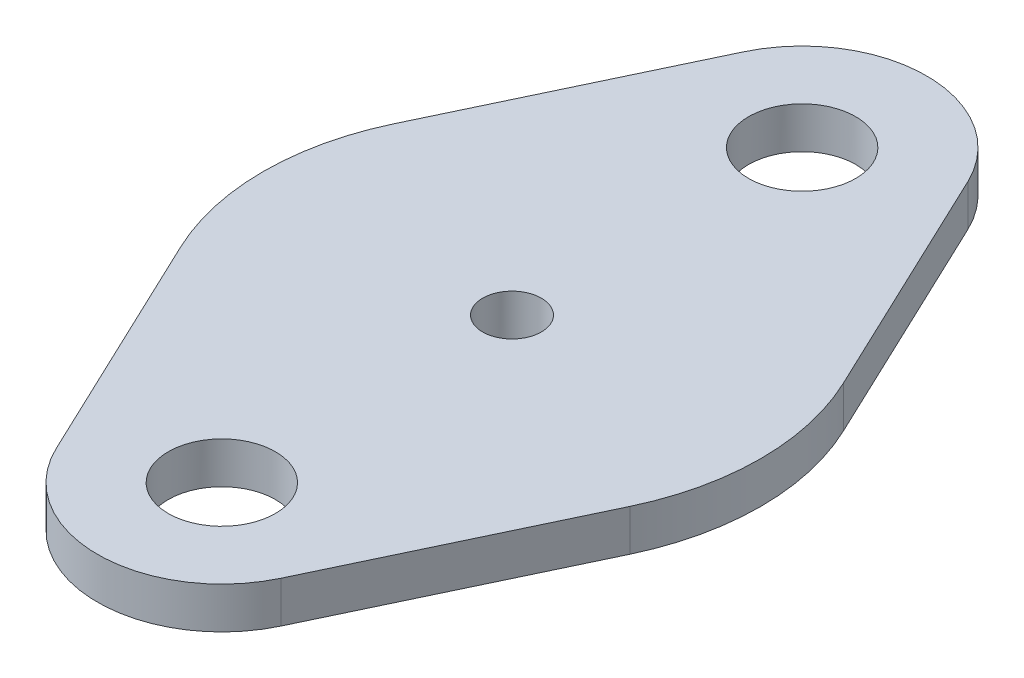
ISO-10303-21;
HEADER;
FILE_DESCRIPTION(('STEP AP214'),'2;1');
FILE_NAME('part.step','',(''),(''),'','','');
FILE_SCHEMA(('AUTOMOTIVE_DESIGN { 1 0 10303 214 1 1 1 1 }'));
ENDSEC;
DATA;
#1=APPLICATION_CONTEXT('core data for automotive mechanical design processes');
#2=APPLICATION_PROTOCOL_DEFINITION('international standard','automotive_design',2000,#1);
#3=PRODUCT_CONTEXT('',#1,'mechanical');
#4=PRODUCT('Part','Part','',(#3));
#5=PRODUCT_RELATED_PRODUCT_CATEGORY('part','',(#4));
#6=PRODUCT_DEFINITION_FORMATION('','',#4);
#7=PRODUCT_DEFINITION_CONTEXT('part definition',#1,'design');
#8=PRODUCT_DEFINITION('design','',#6,#7);
#9=PRODUCT_DEFINITION_SHAPE('','',#8);
#10=(LENGTH_UNIT() NAMED_UNIT(*) SI_UNIT(.MILLI.,.METRE.));
#11=(NAMED_UNIT(*) PLANE_ANGLE_UNIT() SI_UNIT($,.RADIAN.));
#12=(NAMED_UNIT(*) SI_UNIT($,.STERADIAN.) SOLID_ANGLE_UNIT());
#13=UNCERTAINTY_MEASURE_WITH_UNIT(LENGTH_MEASURE(1.E-05),#10,'distance_accuracy_value','');
#14=(GEOMETRIC_REPRESENTATION_CONTEXT(3) GLOBAL_UNCERTAINTY_ASSIGNED_CONTEXT((#13)) GLOBAL_UNIT_ASSIGNED_CONTEXT((#10,
#11,#12)) REPRESENTATION_CONTEXT('',''));
#15=CARTESIAN_POINT('',(0.,0.,0.));
#16=DIRECTION('',(0.,0.,1.));
#17=DIRECTION('',(1.,0.,0.));
#18=AXIS2_PLACEMENT_3D('',#15,#16,#17);
#19=CARTESIAN_POINT('',(0.,3.175,0.));
#20=DIRECTION('',(0.,-1.,0.));
#21=DIRECTION('',(0.,0.,-1.));
#22=AXIS2_PLACEMENT_3D('',#19,#20,#21);
#23=PLANE('',#22);
#24=CARTESIAN_POINT('',(19.05,3.175,-53.975));
#25=DIRECTION('',(0.,1.,0.));
#26=DIRECTION('',(0.,0.,1.));
#27=AXIS2_PLACEMENT_3D('',#24,#25,#26);
#28=CIRCLE('',#27,4.1021);
#29=CARTESIAN_POINT('',(19.05,3.175,-49.8729));
#30=VERTEX_POINT('',#29);
#31=EDGE_CURVE('E150',#30,#30,#28,.T.);
#32=ORIENTED_EDGE('',*,*,#31,.F.);
#33=EDGE_LOOP('',(#32));
#34=FACE_BOUND('',#33,.T.);
#35=CARTESIAN_POINT('',(19.05,3.175,-9.525));
#36=DIRECTION('',(0.,1.,0.));
#37=DIRECTION('',(0.,0.,1.));
#38=AXIS2_PLACEMENT_3D('',#35,#36,#37);
#39=CIRCLE('',#38,4.1021);
#40=CARTESIAN_POINT('',(19.05,3.175,-5.4229));
#41=VERTEX_POINT('',#40);
#42=EDGE_CURVE('E167',#41,#41,#39,.T.);
#43=ORIENTED_EDGE('',*,*,#42,.F.);
#44=EDGE_LOOP('',(#43));
#45=FACE_BOUND('',#44,.T.);
#46=CARTESIAN_POINT('',(19.05,3.175,-31.75));
#47=DIRECTION('',(0.,1.,0.));
#48=DIRECTION('',(0.,0.,1.));
#49=AXIS2_PLACEMENT_3D('',#46,#47,#48);
#50=CIRCLE('',#49,2.2479);
#51=CARTESIAN_POINT('',(19.05,3.175,-29.5021));
#52=VERTEX_POINT('',#51);
#53=EDGE_CURVE('E173',#52,#52,#50,.T.);
#54=ORIENTED_EDGE('',*,*,#53,.F.);
#55=EDGE_LOOP('',(#54));
#56=FACE_BOUND('',#55,.T.);
#57=CARTESIAN_POINT('',(19.05,3.175,-53.975));
#58=DIRECTION('',(0.,1.,0.));
#59=DIRECTION('',(0.,0.,1.));
#60=AXIS2_PLACEMENT_3D('',#57,#58,#59);
#61=CIRCLE('',#60,9.52500000000001);
#62=CARTESIAN_POINT('',(27.6559127751725,3.175,-58.0571428571429));
#63=VERTEX_POINT('',#62);
#64=CARTESIAN_POINT('',(10.4440872248275,3.175,-58.0571428571429));
#65=VERTEX_POINT('',#64);
#66=EDGE_CURVE('E132',#63,#65,#61,.T.);
#67=ORIENTED_EDGE('',*,*,#66,.T.);
#68=DIRECTION('',(-0.428571428571429,0.,0.903507902905251));
#69=VECTOR('',#68,1.);
#70=CARTESIAN_POINT('',(10.4440872248275,3.175,-58.0571428571429));
#71=LINE('',#70,#69);
#72=CARTESIAN_POINT('',(1.83817444965496,3.175,-39.9142857142857));
#73=VERTEX_POINT('',#72);
#74=EDGE_CURVE('E134',#65,#73,#71,.T.);
#75=ORIENTED_EDGE('',*,*,#74,.T.);
#76=CARTESIAN_POINT('',(19.05,3.175,-31.75));
#77=DIRECTION('',(0.,1.,0.));
#78=DIRECTION('',(0.,0.,1.));
#79=AXIS2_PLACEMENT_3D('',#76,#77,#78);
#80=CIRCLE('',#79,19.05);
#81=CARTESIAN_POINT('',(1.83817444965496,3.175,-23.5857142857143));
#82=VERTEX_POINT('',#81);
#83=EDGE_CURVE('E50',#73,#82,#80,.T.);
#84=ORIENTED_EDGE('',*,*,#83,.T.);
#85=DIRECTION('',(0.428571428571429,0.,0.903507902905251));
#86=VECTOR('',#85,1.);
#87=CARTESIAN_POINT('',(1.83817444965496,3.175,-23.5857142857143));
#88=LINE('',#87,#86);
#89=CARTESIAN_POINT('',(10.4440872248275,3.175,-5.44285714285714));
#90=VERTEX_POINT('',#89);
#91=EDGE_CURVE('E116',#82,#90,#88,.T.);
#92=ORIENTED_EDGE('',*,*,#91,.T.);
#93=CARTESIAN_POINT('',(19.05,3.175,-9.525));
#94=DIRECTION('',(0.,1.,0.));
#95=DIRECTION('',(0.,0.,1.));
#96=AXIS2_PLACEMENT_3D('',#93,#94,#95);
#97=CIRCLE('',#96,9.525);
#98=CARTESIAN_POINT('',(27.6559127751725,3.175,-5.44285714285715));
#99=VERTEX_POINT('',#98);
#100=EDGE_CURVE('E139',#90,#99,#97,.T.);
#101=ORIENTED_EDGE('',*,*,#100,.T.);
#102=DIRECTION('',(0.428571428571428,0.,-0.903507902905251));
#103=VECTOR('',#102,1.);
#104=CARTESIAN_POINT('',(36.261825550345,3.175,-23.5857142857143));
#105=LINE('',#104,#103);
#106=CARTESIAN_POINT('',(36.261825550345,3.175,-23.5857142857143));
#107=VERTEX_POINT('',#106);
#108=EDGE_CURVE('E141',#99,#107,#105,.T.);
#109=ORIENTED_EDGE('',*,*,#108,.T.);
#110=CARTESIAN_POINT('',(19.05,3.175,-31.75));
#111=DIRECTION('',(0.,1.,0.));
#112=DIRECTION('',(0.,0.,1.));
#113=AXIS2_PLACEMENT_3D('',#110,#111,#112);
#114=CIRCLE('',#113,19.05);
#115=CARTESIAN_POINT('',(36.261825550345,3.175,-39.9142857142857));
#116=VERTEX_POINT('',#115);
#117=EDGE_CURVE('E144',#107,#116,#114,.T.);
#118=ORIENTED_EDGE('',*,*,#117,.T.);
#119=DIRECTION('',(-0.428571428571428,0.,-0.903507902905251));
#120=VECTOR('',#119,1.);
#121=CARTESIAN_POINT('',(27.6559127751725,3.175,-58.0571428571429));
#122=LINE('',#121,#120);
#123=EDGE_CURVE('E127',#116,#63,#122,.T.);
#124=ORIENTED_EDGE('',*,*,#123,.T.);
#125=EDGE_LOOP('',(#67,#75,#84,#92,#101,#109,#118,#124));
#126=FACE_BOUND('',#125,.T.);
#127=ADVANCED_FACE('F35',(#34,#45,#56,#126),#23,.F.);
#128=CARTESIAN_POINT('',(0.,0.,0.));
#129=DIRECTION('',(0.,-1.,0.));
#130=DIRECTION('',(0.,0.,-1.));
#131=AXIS2_PLACEMENT_3D('',#128,#129,#130);
#132=PLANE('',#131);
#133=CARTESIAN_POINT('',(19.05,0.,-53.975));
#134=DIRECTION('',(0.,-1.,0.));
#135=DIRECTION('',(0.,0.,-1.));
#136=AXIS2_PLACEMENT_3D('',#133,#134,#135);
#137=CIRCLE('',#136,4.1021);
#138=CARTESIAN_POINT('',(19.05,0.,-58.0771));
#139=VERTEX_POINT('',#138);
#140=EDGE_CURVE('E164',#139,#139,#137,.T.);
#141=ORIENTED_EDGE('',*,*,#140,.F.);
#142=EDGE_LOOP('',(#141));
#143=FACE_BOUND('',#142,.T.);
#144=CARTESIAN_POINT('',(19.05,0.,-9.525));
#145=DIRECTION('',(0.,-1.,0.));
#146=DIRECTION('',(0.,0.,-1.));
#147=AXIS2_PLACEMENT_3D('',#144,#145,#146);
#148=CIRCLE('',#147,4.1021);
#149=CARTESIAN_POINT('',(19.05,0.,-13.6271));
#150=VERTEX_POINT('',#149);
#151=EDGE_CURVE('E170',#150,#150,#148,.T.);
#152=ORIENTED_EDGE('',*,*,#151,.F.);
#153=EDGE_LOOP('',(#152));
#154=FACE_BOUND('',#153,.T.);
#155=CARTESIAN_POINT('',(19.05,0.,-31.75));
#156=DIRECTION('',(0.,-1.,0.));
#157=DIRECTION('',(0.,0.,-1.));
#158=AXIS2_PLACEMENT_3D('',#155,#156,#157);
#159=CIRCLE('',#158,2.2479);
#160=CARTESIAN_POINT('',(19.05,0.,-33.9979));
#161=VERTEX_POINT('',#160);
#162=EDGE_CURVE('E109',#161,#161,#159,.T.);
#163=ORIENTED_EDGE('',*,*,#162,.F.);
#164=EDGE_LOOP('',(#163));
#165=FACE_BOUND('',#164,.T.);
#166=DIRECTION('',(-0.428571428571429,0.,0.903507902905251));
#167=VECTOR('',#166,1.);
#168=CARTESIAN_POINT('',(10.4440872248275,0.,-58.0571428571429));
#169=LINE('',#168,#167);
#170=CARTESIAN_POINT('',(10.4440872248275,0.,-58.0571428571429));
#171=VERTEX_POINT('',#170);
#172=CARTESIAN_POINT('',(1.83817444965496,0.,-39.9142857142857));
#173=VERTEX_POINT('',#172);
#174=EDGE_CURVE('E122',#171,#173,#169,.T.);
#175=ORIENTED_EDGE('',*,*,#174,.F.);
#176=CARTESIAN_POINT('',(19.05,0.,-53.975));
#177=DIRECTION('',(0.,-1.,0.));
#178=DIRECTION('',(0.,0.,-1.));
#179=AXIS2_PLACEMENT_3D('',#176,#177,#178);
#180=CIRCLE('',#179,9.52500000000001);
#181=CARTESIAN_POINT('',(27.6559127751725,0.,-58.0571428571429));
#182=VERTEX_POINT('',#181);
#183=EDGE_CURVE('E11',#171,#182,#180,.T.);
#184=ORIENTED_EDGE('',*,*,#183,.T.);
#185=DIRECTION('',(-0.428571428571428,0.,-0.903507902905251));
#186=VECTOR('',#185,1.);
#187=CARTESIAN_POINT('',(27.6559127751725,0.,-58.0571428571429));
#188=LINE('',#187,#186);
#189=CARTESIAN_POINT('',(36.261825550345,0.,-39.9142857142857));
#190=VERTEX_POINT('',#189);
#191=EDGE_CURVE('E125',#190,#182,#188,.T.);
#192=ORIENTED_EDGE('',*,*,#191,.F.);
#193=CARTESIAN_POINT('',(19.05,0.,-31.75));
#194=DIRECTION('',(0.,-1.,0.));
#195=DIRECTION('',(0.,0.,-1.));
#196=AXIS2_PLACEMENT_3D('',#193,#194,#195);
#197=CIRCLE('',#196,19.05);
#198=CARTESIAN_POINT('',(36.261825550345,0.,-23.5857142857143));
#199=VERTEX_POINT('',#198);
#200=EDGE_CURVE('E43',#190,#199,#197,.T.);
#201=ORIENTED_EDGE('',*,*,#200,.T.);
#202=DIRECTION('',(0.428571428571428,0.,-0.903507902905251));
#203=VECTOR('',#202,1.);
#204=CARTESIAN_POINT('',(36.261825550345,0.,-23.5857142857143));
#205=LINE('',#204,#203);
#206=CARTESIAN_POINT('',(27.6559127751725,0.,-5.44285714285715));
#207=VERTEX_POINT('',#206);
#208=EDGE_CURVE('E121',#207,#199,#205,.T.);
#209=ORIENTED_EDGE('',*,*,#208,.F.);
#210=CARTESIAN_POINT('',(19.05,0.,-9.525));
#211=DIRECTION('',(0.,-1.,0.));
#212=DIRECTION('',(0.,0.,-1.));
#213=AXIS2_PLACEMENT_3D('',#210,#211,#212);
#214=CIRCLE('',#213,9.525);
#215=CARTESIAN_POINT('',(10.4440872248275,0.,-5.44285714285714));
#216=VERTEX_POINT('',#215);
#217=EDGE_CURVE('E108',#207,#216,#214,.T.);
#218=ORIENTED_EDGE('',*,*,#217,.T.);
#219=DIRECTION('',(0.428571428571429,0.,0.903507902905251));
#220=VECTOR('',#219,1.);
#221=CARTESIAN_POINT('',(1.83817444965496,0.,-23.5857142857143));
#222=LINE('',#221,#220);
#223=CARTESIAN_POINT('',(1.83817444965496,0.,-23.5857142857143));
#224=VERTEX_POINT('',#223);
#225=EDGE_CURVE('E114',#224,#216,#222,.T.);
#226=ORIENTED_EDGE('',*,*,#225,.F.);
#227=CARTESIAN_POINT('',(19.05,0.,-31.75));
#228=DIRECTION('',(0.,-1.,0.));
#229=DIRECTION('',(0.,0.,-1.));
#230=AXIS2_PLACEMENT_3D('',#227,#228,#229);
#231=CIRCLE('',#230,19.05);
#232=EDGE_CURVE('E99',#224,#173,#231,.T.);
#233=ORIENTED_EDGE('',*,*,#232,.T.);
#234=EDGE_LOOP('',(#175,#184,#192,#201,#209,#218,#226,#233));
#235=FACE_BOUND('',#234,.T.);
#236=ADVANCED_FACE('F37',(#143,#154,#165,#235),#132,.T.);
#237=CARTESIAN_POINT('',(19.05,3.175,-31.75));
#238=DIRECTION('',(0.,1.,0.));
#239=DIRECTION('',(0.,0.,1.));
#240=AXIS2_PLACEMENT_3D('',#237,#238,#239);
#241=CYLINDRICAL_SURFACE('',#240,2.2479);
#242=ORIENTED_EDGE('',*,*,#53,.T.);
#243=EDGE_LOOP('',(#242));
#244=FACE_BOUND('',#243,.T.);
#245=ORIENTED_EDGE('',*,*,#162,.T.);
#246=EDGE_LOOP('',(#245));
#247=FACE_BOUND('',#246,.T.);
#248=ADVANCED_FACE('F214',(#244,#247),#241,.F.);
#249=CARTESIAN_POINT('',(19.05,3.175,-9.525));
#250=DIRECTION('',(0.,1.,0.));
#251=DIRECTION('',(0.,0.,1.));
#252=AXIS2_PLACEMENT_3D('',#249,#250,#251);
#253=CYLINDRICAL_SURFACE('',#252,4.1021);
#254=ORIENTED_EDGE('',*,*,#42,.T.);
#255=EDGE_LOOP('',(#254));
#256=FACE_BOUND('',#255,.T.);
#257=ORIENTED_EDGE('',*,*,#151,.T.);
#258=EDGE_LOOP('',(#257));
#259=FACE_BOUND('',#258,.T.);
#260=ADVANCED_FACE('F221',(#256,#259),#253,.F.);
#261=CARTESIAN_POINT('',(19.05,3.175,-53.975));
#262=DIRECTION('',(0.,1.,0.));
#263=DIRECTION('',(0.,0.,1.));
#264=AXIS2_PLACEMENT_3D('',#261,#262,#263);
#265=CYLINDRICAL_SURFACE('',#264,4.1021);
#266=ORIENTED_EDGE('',*,*,#31,.T.);
#267=EDGE_LOOP('',(#266));
#268=FACE_BOUND('',#267,.T.);
#269=ORIENTED_EDGE('',*,*,#140,.T.);
#270=EDGE_LOOP('',(#269));
#271=FACE_BOUND('',#270,.T.);
#272=ADVANCED_FACE('F225',(#268,#271),#265,.F.);
#273=CARTESIAN_POINT('',(19.05,0.,-53.975));
#274=DIRECTION('',(0.,1.,0.));
#275=DIRECTION('',(0.,0.,1.));
#276=AXIS2_PLACEMENT_3D('',#273,#274,#275);
#277=CYLINDRICAL_SURFACE('',#276,9.52500000000001);
#278=DIRECTION('',(0.,1.,0.));
#279=VECTOR('',#278,1.);
#280=CARTESIAN_POINT('',(27.6559127751725,0.,-58.0571428571429));
#281=LINE('',#280,#279);
#282=EDGE_CURVE('E148',#182,#63,#281,.T.);
#283=ORIENTED_EDGE('',*,*,#282,.F.);
#284=ORIENTED_EDGE('',*,*,#183,.F.);
#285=DIRECTION('',(0.,1.,0.));
#286=VECTOR('',#285,1.);
#287=CARTESIAN_POINT('',(10.4440872248275,0.,-58.0571428571429));
#288=LINE('',#287,#286);
#289=EDGE_CURVE('E58',#171,#65,#288,.T.);
#290=ORIENTED_EDGE('',*,*,#289,.T.);
#291=ORIENTED_EDGE('',*,*,#66,.F.);
#292=EDGE_LOOP('',(#283,#284,#290,#291));
#293=FACE_BOUND('',#292,.T.);
#294=ADVANCED_FACE('F196',(#293),#277,.T.);
#295=CARTESIAN_POINT('',(19.05,0.,-31.75));
#296=DIRECTION('',(0.,1.,0.));
#297=DIRECTION('',(0.,0.,1.));
#298=AXIS2_PLACEMENT_3D('',#295,#296,#297);
#299=CYLINDRICAL_SURFACE('',#298,19.05);
#300=DIRECTION('',(0.,1.,0.));
#301=VECTOR('',#300,1.);
#302=CARTESIAN_POINT('',(36.261825550345,0.,-23.5857142857143));
#303=LINE('',#302,#301);
#304=EDGE_CURVE('E154',#199,#107,#303,.T.);
#305=ORIENTED_EDGE('',*,*,#304,.F.);
#306=ORIENTED_EDGE('',*,*,#200,.F.);
#307=DIRECTION('',(0.,1.,0.));
#308=VECTOR('',#307,1.);
#309=CARTESIAN_POINT('',(36.261825550345,0.,-39.9142857142857));
#310=LINE('',#309,#308);
#311=EDGE_CURVE('E151',#190,#116,#310,.T.);
#312=ORIENTED_EDGE('',*,*,#311,.T.);
#313=ORIENTED_EDGE('',*,*,#117,.F.);
#314=EDGE_LOOP('',(#305,#306,#312,#313));
#315=FACE_BOUND('',#314,.T.);
#316=ADVANCED_FACE('F183',(#315),#299,.T.);
#317=CARTESIAN_POINT('',(19.05,0.,-9.525));
#318=DIRECTION('',(0.,1.,0.));
#319=DIRECTION('',(0.,0.,1.));
#320=AXIS2_PLACEMENT_3D('',#317,#318,#319);
#321=CYLINDRICAL_SURFACE('',#320,9.525);
#322=DIRECTION('',(0.,1.,0.));
#323=VECTOR('',#322,1.);
#324=CARTESIAN_POINT('',(10.4440872248275,0.,-5.44285714285714));
#325=LINE('',#324,#323);
#326=EDGE_CURVE('E117',#216,#90,#325,.T.);
#327=ORIENTED_EDGE('',*,*,#326,.F.);
#328=ORIENTED_EDGE('',*,*,#217,.F.);
#329=DIRECTION('',(0.,1.,0.));
#330=VECTOR('',#329,1.);
#331=CARTESIAN_POINT('',(27.6559127751725,0.,-5.44285714285715));
#332=LINE('',#331,#330);
#333=EDGE_CURVE('E156',#207,#99,#332,.T.);
#334=ORIENTED_EDGE('',*,*,#333,.T.);
#335=ORIENTED_EDGE('',*,*,#100,.F.);
#336=EDGE_LOOP('',(#327,#328,#334,#335));
#337=FACE_BOUND('',#336,.T.);
#338=ADVANCED_FACE('F190',(#337),#321,.T.);
#339=CARTESIAN_POINT('',(19.05,0.,-31.75));
#340=DIRECTION('',(0.,1.,0.));
#341=DIRECTION('',(0.,0.,1.));
#342=AXIS2_PLACEMENT_3D('',#339,#340,#341);
#343=CYLINDRICAL_SURFACE('',#342,19.05);
#344=DIRECTION('',(0.,1.,0.));
#345=VECTOR('',#344,1.);
#346=CARTESIAN_POINT('',(1.83817444965495,0.,-39.9142857142857));
#347=LINE('',#346,#345);
#348=EDGE_CURVE('E104',#173,#73,#347,.T.);
#349=ORIENTED_EDGE('',*,*,#348,.F.);
#350=ORIENTED_EDGE('',*,*,#232,.F.);
#351=DIRECTION('',(0.,1.,0.));
#352=VECTOR('',#351,1.);
#353=CARTESIAN_POINT('',(1.83817444965496,0.,-23.5857142857143));
#354=LINE('',#353,#352);
#355=EDGE_CURVE('E102',#224,#82,#354,.T.);
#356=ORIENTED_EDGE('',*,*,#355,.T.);
#357=ORIENTED_EDGE('',*,*,#83,.F.);
#358=EDGE_LOOP('',(#349,#350,#356,#357));
#359=FACE_BOUND('',#358,.T.);
#360=ADVANCED_FACE('F101',(#359),#343,.T.);
#361=CARTESIAN_POINT('',(27.6559127751725,0.,-58.0571428571429));
#362=DIRECTION('',(0.903507902905251,0.,-0.428571428571428));
#363=DIRECTION('',(-0.428571428571428,0.,-0.903507902905251));
#364=AXIS2_PLACEMENT_3D('',#361,#362,#363);
#365=PLANE('',#364);
#366=ORIENTED_EDGE('',*,*,#123,.F.);
#367=ORIENTED_EDGE('',*,*,#311,.F.);
#368=ORIENTED_EDGE('',*,*,#191,.T.);
#369=ORIENTED_EDGE('',*,*,#282,.T.);
#370=EDGE_LOOP('',(#366,#367,#368,#369));
#371=FACE_BOUND('',#370,.T.);
#372=ADVANCED_FACE('F199',(#371),#365,.T.);
#373=CARTESIAN_POINT('',(36.261825550345,0.,-23.5857142857143));
#374=DIRECTION('',(0.903507902905251,0.,0.428571428571428));
#375=DIRECTION('',(0.428571428571428,0.,-0.903507902905251));
#376=AXIS2_PLACEMENT_3D('',#373,#374,#375);
#377=PLANE('',#376);
#378=ORIENTED_EDGE('',*,*,#108,.F.);
#379=ORIENTED_EDGE('',*,*,#333,.F.);
#380=ORIENTED_EDGE('',*,*,#208,.T.);
#381=ORIENTED_EDGE('',*,*,#304,.T.);
#382=EDGE_LOOP('',(#378,#379,#380,#381));
#383=FACE_BOUND('',#382,.T.);
#384=ADVANCED_FACE('F187',(#383),#377,.T.);
#385=CARTESIAN_POINT('',(1.83817444965496,0.,-23.5857142857143));
#386=DIRECTION('',(-0.903507902905251,0.,0.428571428571429));
#387=DIRECTION('',(0.42857142857143,0.,0.903507902905251));
#388=AXIS2_PLACEMENT_3D('',#385,#386,#387);
#389=PLANE('',#388);
#390=ORIENTED_EDGE('',*,*,#91,.F.);
#391=ORIENTED_EDGE('',*,*,#355,.F.);
#392=ORIENTED_EDGE('',*,*,#225,.T.);
#393=ORIENTED_EDGE('',*,*,#326,.T.);
#394=EDGE_LOOP('',(#390,#391,#392,#393));
#395=FACE_BOUND('',#394,.T.);
#396=ADVANCED_FACE('F113',(#395),#389,.T.);
#397=CARTESIAN_POINT('',(10.4440872248275,0.,-58.0571428571429));
#398=DIRECTION('',(-0.903507902905251,0.,-0.428571428571429));
#399=DIRECTION('',(-0.428571428571429,0.,0.903507902905251));
#400=AXIS2_PLACEMENT_3D('',#397,#398,#399);
#401=PLANE('',#400);
#402=ORIENTED_EDGE('',*,*,#74,.F.);
#403=ORIENTED_EDGE('',*,*,#289,.F.);
#404=ORIENTED_EDGE('',*,*,#174,.T.);
#405=ORIENTED_EDGE('',*,*,#348,.T.);
#406=EDGE_LOOP('',(#402,#403,#404,#405));
#407=FACE_BOUND('',#406,.T.);
#408=ADVANCED_FACE('F193',(#407),#401,.T.);
#409=CLOSED_SHELL('',(#127,#236,#248,#260,#272,#294,#316,#338,#360,#372,#384,#396,#408));
#410=MANIFOLD_SOLID_BREP('B2',#409);
#411=ADVANCED_BREP_SHAPE_REPRESENTATION('',(#18,#410),#14);
#412=SHAPE_DEFINITION_REPRESENTATION(#9,#411);
ENDSEC;
END-ISO-10303-21;
